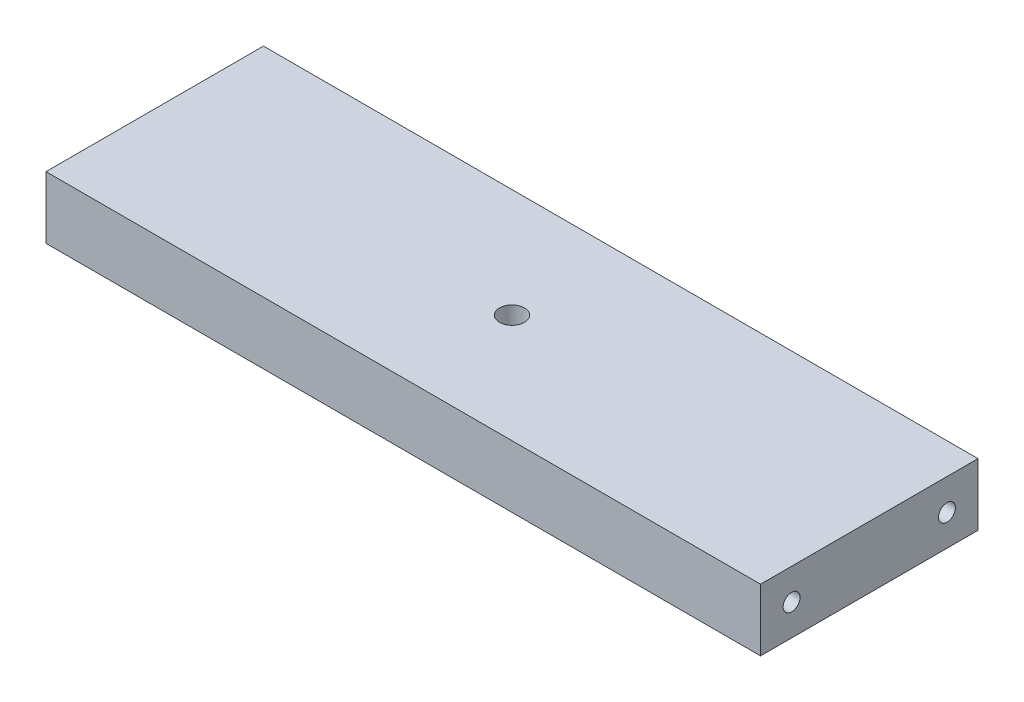
ISO-10303-21;
HEADER;
FILE_DESCRIPTION(('STEP AP214'),'2;1');
FILE_NAME('part.step','',(''),(''),'','','');
FILE_SCHEMA(('AUTOMOTIVE_DESIGN { 1 0 10303 214 1 1 1 1 }'));
ENDSEC;
DATA;
#1=APPLICATION_CONTEXT('core data for automotive mechanical design processes');
#2=APPLICATION_PROTOCOL_DEFINITION('international standard','automotive_design',2000,#1);
#3=PRODUCT_CONTEXT('',#1,'mechanical');
#4=PRODUCT('Part','Part','',(#3));
#5=PRODUCT_RELATED_PRODUCT_CATEGORY('part','',(#4));
#6=PRODUCT_DEFINITION_FORMATION('','',#4);
#7=PRODUCT_DEFINITION_CONTEXT('part definition',#1,'design');
#8=PRODUCT_DEFINITION('design','',#6,#7);
#9=PRODUCT_DEFINITION_SHAPE('','',#8);
#10=(LENGTH_UNIT() NAMED_UNIT(*) SI_UNIT(.MILLI.,.METRE.));
#11=(NAMED_UNIT(*) PLANE_ANGLE_UNIT() SI_UNIT($,.RADIAN.));
#12=(NAMED_UNIT(*) SI_UNIT($,.STERADIAN.) SOLID_ANGLE_UNIT());
#13=UNCERTAINTY_MEASURE_WITH_UNIT(LENGTH_MEASURE(1.E-05),#10,'distance_accuracy_value','');
#14=(GEOMETRIC_REPRESENTATION_CONTEXT(3) GLOBAL_UNCERTAINTY_ASSIGNED_CONTEXT((#13)) GLOBAL_UNIT_ASSIGNED_CONTEXT((#10,
#11,#12)) REPRESENTATION_CONTEXT('',''));
#15=CARTESIAN_POINT('',(0.,0.,0.));
#16=DIRECTION('',(0.,0.,1.));
#17=DIRECTION('',(1.,0.,0.));
#18=AXIS2_PLACEMENT_3D('',#15,#16,#17);
#19=CARTESIAN_POINT('',(73.025,12.7,22.225));
#20=DIRECTION('',(-1.,0.,0.));
#21=DIRECTION('',(0.,0.,1.));
#22=AXIS2_PLACEMENT_3D('',#19,#20,#21);
#23=PLANE('',#22);
#24=CARTESIAN_POINT('',(73.025,6.35,-15.875));
#25=DIRECTION('',(1.,0.,0.));
#26=DIRECTION('',(0.,0.,-1.));
#27=AXIS2_PLACEMENT_3D('',#24,#25,#26);
#28=CIRCLE('',#27,1.72719999999999);
#29=CARTESIAN_POINT('',(73.025,6.35,-17.6022));
#30=VERTEX_POINT('',#29);
#31=EDGE_CURVE('E114',#30,#30,#28,.T.);
#32=ORIENTED_EDGE('',*,*,#31,.F.);
#33=EDGE_LOOP('',(#32));
#34=FACE_BOUND('',#33,.T.);
#35=CARTESIAN_POINT('',(73.025,6.35,15.875));
#36=DIRECTION('',(1.,0.,0.));
#37=DIRECTION('',(0.,0.,-1.));
#38=AXIS2_PLACEMENT_3D('',#35,#36,#37);
#39=CIRCLE('',#38,1.72719999999999);
#40=CARTESIAN_POINT('',(73.025,6.35,14.1478));
#41=VERTEX_POINT('',#40);
#42=EDGE_CURVE('E113',#41,#41,#39,.T.);
#43=ORIENTED_EDGE('',*,*,#42,.F.);
#44=EDGE_LOOP('',(#43));
#45=FACE_BOUND('',#44,.T.);
#46=DIRECTION('',(0.,0.,-1.));
#47=VECTOR('',#46,1.);
#48=CARTESIAN_POINT('',(73.025,0.,22.225));
#49=LINE('',#48,#47);
#50=CARTESIAN_POINT('',(73.025,0.,22.225));
#51=VERTEX_POINT('',#50);
#52=CARTESIAN_POINT('',(73.025,0.,-22.225));
#53=VERTEX_POINT('',#52);
#54=EDGE_CURVE('E151',#51,#53,#49,.T.);
#55=ORIENTED_EDGE('',*,*,#54,.T.);
#56=DIRECTION('',(0.,-1.,0.));
#57=VECTOR('',#56,1.);
#58=CARTESIAN_POINT('',(73.025,12.7,-22.225));
#59=LINE('',#58,#57);
#60=CARTESIAN_POINT('',(73.025,12.7,-22.225));
#61=VERTEX_POINT('',#60);
#62=EDGE_CURVE('E11',#61,#53,#59,.T.);
#63=ORIENTED_EDGE('',*,*,#62,.F.);
#64=DIRECTION('',(0.,0.,-1.));
#65=VECTOR('',#64,1.);
#66=CARTESIAN_POINT('',(73.025,12.7,22.225));
#67=LINE('',#66,#65);
#68=CARTESIAN_POINT('',(73.025,12.7,22.225));
#69=VERTEX_POINT('',#68);
#70=EDGE_CURVE('E152',#69,#61,#67,.T.);
#71=ORIENTED_EDGE('',*,*,#70,.F.);
#72=DIRECTION('',(0.,-1.,0.));
#73=VECTOR('',#72,1.);
#74=CARTESIAN_POINT('',(73.025,12.7,22.225));
#75=LINE('',#74,#73);
#76=EDGE_CURVE('E162',#69,#51,#75,.T.);
#77=ORIENTED_EDGE('',*,*,#76,.T.);
#78=EDGE_LOOP('',(#55,#63,#71,#77));
#79=FACE_BOUND('',#78,.T.);
#80=ADVANCED_FACE('F41',(#34,#45,#79),#23,.F.);
#81=CARTESIAN_POINT('',(-73.025,12.7,-22.225));
#82=DIRECTION('',(0.,0.,1.));
#83=DIRECTION('',(1.,0.,0.));
#84=AXIS2_PLACEMENT_3D('',#81,#82,#83);
#85=PLANE('',#84);
#86=DIRECTION('',(-1.,0.,0.));
#87=VECTOR('',#86,1.);
#88=CARTESIAN_POINT('',(-73.025,0.,-22.225));
#89=LINE('',#88,#87);
#90=CARTESIAN_POINT('',(-73.025,0.,-22.225));
#91=VERTEX_POINT('',#90);
#92=EDGE_CURVE('E166',#53,#91,#89,.T.);
#93=ORIENTED_EDGE('',*,*,#92,.T.);
#94=DIRECTION('',(0.,-1.,0.));
#95=VECTOR('',#94,1.);
#96=CARTESIAN_POINT('',(-73.025,12.7,-22.225));
#97=LINE('',#96,#95);
#98=CARTESIAN_POINT('',(-73.025,12.7,-22.225));
#99=VERTEX_POINT('',#98);
#100=EDGE_CURVE('E50',#99,#91,#97,.T.);
#101=ORIENTED_EDGE('',*,*,#100,.F.);
#102=DIRECTION('',(-1.,0.,0.));
#103=VECTOR('',#102,1.);
#104=CARTESIAN_POINT('',(-73.025,12.7,-22.225));
#105=LINE('',#104,#103);
#106=EDGE_CURVE('E89',#61,#99,#105,.T.);
#107=ORIENTED_EDGE('',*,*,#106,.F.);
#108=ORIENTED_EDGE('',*,*,#62,.T.);
#109=EDGE_LOOP('',(#93,#101,#107,#108));
#110=FACE_BOUND('',#109,.T.);
#111=ADVANCED_FACE('F196',(#110),#85,.F.);
#112=CARTESIAN_POINT('',(-73.025,12.7,22.225));
#113=DIRECTION('',(1.,0.,0.));
#114=DIRECTION('',(0.,0.,-1.));
#115=AXIS2_PLACEMENT_3D('',#112,#113,#114);
#116=PLANE('',#115);
#117=CARTESIAN_POINT('',(-73.025,6.35,-15.875));
#118=DIRECTION('',(-1.,0.,0.));
#119=DIRECTION('',(0.,0.,1.));
#120=AXIS2_PLACEMENT_3D('',#117,#118,#119);
#121=CIRCLE('',#120,1.72719999999999);
#122=CARTESIAN_POINT('',(-73.025,6.35,-14.1478));
#123=VERTEX_POINT('',#122);
#124=EDGE_CURVE('E127',#123,#123,#121,.T.);
#125=ORIENTED_EDGE('',*,*,#124,.F.);
#126=EDGE_LOOP('',(#125));
#127=FACE_BOUND('',#126,.T.);
#128=CARTESIAN_POINT('',(-73.025,6.35,15.875));
#129=DIRECTION('',(-1.,0.,0.));
#130=DIRECTION('',(0.,0.,1.));
#131=AXIS2_PLACEMENT_3D('',#128,#129,#130);
#132=CIRCLE('',#131,1.72719999999999);
#133=CARTESIAN_POINT('',(-73.025,6.35,17.6022));
#134=VERTEX_POINT('',#133);
#135=EDGE_CURVE('E135',#134,#134,#132,.T.);
#136=ORIENTED_EDGE('',*,*,#135,.F.);
#137=EDGE_LOOP('',(#136));
#138=FACE_BOUND('',#137,.T.);
#139=DIRECTION('',(0.,0.,1.));
#140=VECTOR('',#139,1.);
#141=CARTESIAN_POINT('',(-73.025,0.,22.225));
#142=LINE('',#141,#140);
#143=CARTESIAN_POINT('',(-73.025,0.,22.225));
#144=VERTEX_POINT('',#143);
#145=EDGE_CURVE('E76',#91,#144,#142,.T.);
#146=ORIENTED_EDGE('',*,*,#145,.T.);
#147=DIRECTION('',(0.,-1.,0.));
#148=VECTOR('',#147,1.);
#149=CARTESIAN_POINT('',(-73.025,12.7,22.225));
#150=LINE('',#149,#148);
#151=CARTESIAN_POINT('',(-73.025,12.7,22.225));
#152=VERTEX_POINT('',#151);
#153=EDGE_CURVE('E175',#152,#144,#150,.T.);
#154=ORIENTED_EDGE('',*,*,#153,.F.);
#155=DIRECTION('',(0.,0.,1.));
#156=VECTOR('',#155,1.);
#157=CARTESIAN_POINT('',(-73.025,12.7,22.225));
#158=LINE('',#157,#156);
#159=EDGE_CURVE('E157',#99,#152,#158,.T.);
#160=ORIENTED_EDGE('',*,*,#159,.F.);
#161=ORIENTED_EDGE('',*,*,#100,.T.);
#162=EDGE_LOOP('',(#146,#154,#160,#161));
#163=FACE_BOUND('',#162,.T.);
#164=ADVANCED_FACE('F179',(#127,#138,#163),#116,.F.);
#165=CARTESIAN_POINT('',(-73.025,12.7,22.225));
#166=DIRECTION('',(0.,0.,-1.));
#167=DIRECTION('',(-1.,0.,0.));
#168=AXIS2_PLACEMENT_3D('',#165,#166,#167);
#169=PLANE('',#168);
#170=DIRECTION('',(1.,0.,0.));
#171=VECTOR('',#170,1.);
#172=CARTESIAN_POINT('',(-73.025,0.,22.225));
#173=LINE('',#172,#171);
#174=EDGE_CURVE('E82',#144,#51,#173,.T.);
#175=ORIENTED_EDGE('',*,*,#174,.T.);
#176=ORIENTED_EDGE('',*,*,#76,.F.);
#177=DIRECTION('',(1.,0.,0.));
#178=VECTOR('',#177,1.);
#179=CARTESIAN_POINT('',(-73.025,12.7,22.225));
#180=LINE('',#179,#178);
#181=EDGE_CURVE('E58',#152,#69,#180,.T.);
#182=ORIENTED_EDGE('',*,*,#181,.F.);
#183=ORIENTED_EDGE('',*,*,#153,.T.);
#184=EDGE_LOOP('',(#175,#176,#182,#183));
#185=FACE_BOUND('',#184,.T.);
#186=ADVANCED_FACE('F186',(#185),#169,.F.);
#187=CARTESIAN_POINT('',(0.,12.7,0.));
#188=DIRECTION('',(0.,-1.,0.));
#189=DIRECTION('',(0.,0.,-1.));
#190=AXIS2_PLACEMENT_3D('',#187,#188,#189);
#191=PLANE('',#190);
#192=CARTESIAN_POINT('',(0.,12.7,0.));
#193=DIRECTION('',(0.,-1.,0.));
#194=DIRECTION('',(0.,0.,-1.));
#195=AXIS2_PLACEMENT_3D('',#192,#193,#194);
#196=CIRCLE('',#195,2.5527);
#197=CARTESIAN_POINT('',(0.,12.7,-2.5527));
#198=VERTEX_POINT('',#197);
#199=EDGE_CURVE('E147',#198,#198,#196,.T.);
#200=ORIENTED_EDGE('',*,*,#199,.T.);
#201=EDGE_LOOP('',(#200));
#202=FACE_BOUND('',#201,.T.);
#203=ORIENTED_EDGE('',*,*,#70,.T.);
#204=ORIENTED_EDGE('',*,*,#106,.T.);
#205=ORIENTED_EDGE('',*,*,#159,.T.);
#206=ORIENTED_EDGE('',*,*,#181,.T.);
#207=EDGE_LOOP('',(#203,#204,#205,#206));
#208=FACE_BOUND('',#207,.T.);
#209=ADVANCED_FACE('F188',(#202,#208),#191,.F.);
#210=CARTESIAN_POINT('',(0.,0.,0.));
#211=DIRECTION('',(0.,-1.,0.));
#212=DIRECTION('',(0.,0.,-1.));
#213=AXIS2_PLACEMENT_3D('',#210,#211,#212);
#214=PLANE('',#213);
#215=CARTESIAN_POINT('',(0.,0.,0.));
#216=DIRECTION('',(0.,-1.,0.));
#217=DIRECTION('',(0.,0.,-1.));
#218=AXIS2_PLACEMENT_3D('',#215,#216,#217);
#219=CIRCLE('',#218,2.5527);
#220=CARTESIAN_POINT('',(0.,0.,-2.5527));
#221=VERTEX_POINT('',#220);
#222=EDGE_CURVE('E143',#221,#221,#219,.T.);
#223=ORIENTED_EDGE('',*,*,#222,.F.);
#224=EDGE_LOOP('',(#223));
#225=FACE_BOUND('',#224,.T.);
#226=ORIENTED_EDGE('',*,*,#54,.F.);
#227=ORIENTED_EDGE('',*,*,#174,.F.);
#228=ORIENTED_EDGE('',*,*,#145,.F.);
#229=ORIENTED_EDGE('',*,*,#92,.F.);
#230=EDGE_LOOP('',(#226,#227,#228,#229));
#231=FACE_BOUND('',#230,.T.);
#232=ADVANCED_FACE('F182',(#225,#231),#214,.T.);
#233=CARTESIAN_POINT('',(0.,0.,0.));
#234=DIRECTION('',(0.,-1.,0.));
#235=DIRECTION('',(0.,0.,-1.));
#236=AXIS2_PLACEMENT_3D('',#233,#234,#235);
#237=CYLINDRICAL_SURFACE('',#236,2.5527);
#238=ORIENTED_EDGE('',*,*,#199,.F.);
#239=EDGE_LOOP('',(#238));
#240=FACE_BOUND('',#239,.T.);
#241=ORIENTED_EDGE('',*,*,#222,.T.);
#242=EDGE_LOOP('',(#241));
#243=FACE_BOUND('',#242,.T.);
#244=ADVANCED_FACE('F236',(#240,#243),#237,.F.);
#245=CARTESIAN_POINT('',(-66.675,6.35,15.875));
#246=DIRECTION('',(-1.,0.,0.));
#247=DIRECTION('',(0.,0.,1.));
#248=AXIS2_PLACEMENT_3D('',#245,#246,#247);
#249=CONICAL_SURFACE('',#248,1.7272,1.02974425867665);
#250=CARTESIAN_POINT('',(-65.6371935388156,6.35,15.875));
#251=VERTEX_POINT('',#250);
#252=VERTEX_LOOP('',#251);
#253=FACE_BOUND('',#252,.T.);
#254=CARTESIAN_POINT('',(-66.675,6.35,15.875));
#255=DIRECTION('',(-1.,0.,0.));
#256=DIRECTION('',(0.,0.,1.));
#257=AXIS2_PLACEMENT_3D('',#254,#255,#256);
#258=CIRCLE('',#257,1.7272);
#259=CARTESIAN_POINT('',(-66.675,6.35,17.6022));
#260=VERTEX_POINT('',#259);
#261=EDGE_CURVE('E139',#260,#260,#258,.T.);
#262=ORIENTED_EDGE('',*,*,#261,.T.);
#263=EDGE_LOOP('',(#262));
#264=FACE_BOUND('',#263,.T.);
#265=ADVANCED_FACE('F232',(#253,#264),#249,.F.);
#266=CARTESIAN_POINT('',(-73.025,6.35,15.875));
#267=DIRECTION('',(-1.,0.,0.));
#268=DIRECTION('',(0.,0.,1.));
#269=AXIS2_PLACEMENT_3D('',#266,#267,#268);
#270=CYLINDRICAL_SURFACE('',#269,1.72719999999999);
#271=ORIENTED_EDGE('',*,*,#261,.F.);
#272=EDGE_LOOP('',(#271));
#273=FACE_BOUND('',#272,.T.);
#274=ORIENTED_EDGE('',*,*,#135,.T.);
#275=EDGE_LOOP('',(#274));
#276=FACE_BOUND('',#275,.T.);
#277=ADVANCED_FACE('F228',(#273,#276),#270,.F.);
#278=CARTESIAN_POINT('',(-66.675,6.35,-15.875));
#279=DIRECTION('',(-1.,0.,0.));
#280=DIRECTION('',(0.,0.,1.));
#281=AXIS2_PLACEMENT_3D('',#278,#279,#280);
#282=CONICAL_SURFACE('',#281,1.7272,1.02974425867665);
#283=CARTESIAN_POINT('',(-65.6371935388156,6.35,-15.875));
#284=VERTEX_POINT('',#283);
#285=VERTEX_LOOP('',#284);
#286=FACE_BOUND('',#285,.T.);
#287=CARTESIAN_POINT('',(-66.675,6.35,-15.875));
#288=DIRECTION('',(-1.,0.,0.));
#289=DIRECTION('',(0.,0.,1.));
#290=AXIS2_PLACEMENT_3D('',#287,#288,#289);
#291=CIRCLE('',#290,1.7272);
#292=CARTESIAN_POINT('',(-66.675,6.35,-14.1478));
#293=VERTEX_POINT('',#292);
#294=EDGE_CURVE('E131',#293,#293,#291,.T.);
#295=ORIENTED_EDGE('',*,*,#294,.T.);
#296=EDGE_LOOP('',(#295));
#297=FACE_BOUND('',#296,.T.);
#298=ADVANCED_FACE('F224',(#286,#297),#282,.F.);
#299=CARTESIAN_POINT('',(-73.025,6.35,-15.875));
#300=DIRECTION('',(-1.,0.,0.));
#301=DIRECTION('',(0.,0.,1.));
#302=AXIS2_PLACEMENT_3D('',#299,#300,#301);
#303=CYLINDRICAL_SURFACE('',#302,1.72719999999999);
#304=ORIENTED_EDGE('',*,*,#294,.F.);
#305=EDGE_LOOP('',(#304));
#306=FACE_BOUND('',#305,.T.);
#307=ORIENTED_EDGE('',*,*,#124,.T.);
#308=EDGE_LOOP('',(#307));
#309=FACE_BOUND('',#308,.T.);
#310=ADVANCED_FACE('F216',(#306,#309),#303,.F.);
#311=CARTESIAN_POINT('',(66.675,6.35,15.875));
#312=DIRECTION('',(1.,0.,0.));
#313=DIRECTION('',(0.,0.,-1.));
#314=AXIS2_PLACEMENT_3D('',#311,#312,#313);
#315=CONICAL_SURFACE('',#314,1.7272,1.02974425867665);
#316=CARTESIAN_POINT('',(65.6371935388156,6.35,15.875));
#317=VERTEX_POINT('',#316);
#318=VERTEX_LOOP('',#317);
#319=FACE_BOUND('',#318,.T.);
#320=CARTESIAN_POINT('',(66.675,6.35,15.875));
#321=DIRECTION('',(1.,0.,0.));
#322=DIRECTION('',(0.,0.,-1.));
#323=AXIS2_PLACEMENT_3D('',#320,#321,#322);
#324=CIRCLE('',#323,1.7272);
#325=CARTESIAN_POINT('',(66.675,6.35,14.1478));
#326=VERTEX_POINT('',#325);
#327=EDGE_CURVE('E119',#326,#326,#324,.T.);
#328=ORIENTED_EDGE('',*,*,#327,.T.);
#329=EDGE_LOOP('',(#328));
#330=FACE_BOUND('',#329,.T.);
#331=ADVANCED_FACE('F210',(#319,#330),#315,.F.);
#332=CARTESIAN_POINT('',(73.025,6.35,15.875));
#333=DIRECTION('',(1.,0.,0.));
#334=DIRECTION('',(0.,0.,-1.));
#335=AXIS2_PLACEMENT_3D('',#332,#333,#334);
#336=CYLINDRICAL_SURFACE('',#335,1.72719999999999);
#337=ORIENTED_EDGE('',*,*,#327,.F.);
#338=EDGE_LOOP('',(#337));
#339=FACE_BOUND('',#338,.T.);
#340=ORIENTED_EDGE('',*,*,#42,.T.);
#341=EDGE_LOOP('',(#340));
#342=FACE_BOUND('',#341,.T.);
#343=ADVANCED_FACE('F106',(#339,#342),#336,.F.);
#344=CARTESIAN_POINT('',(66.675,6.35,-15.875));
#345=DIRECTION('',(1.,0.,0.));
#346=DIRECTION('',(0.,0.,-1.));
#347=AXIS2_PLACEMENT_3D('',#344,#345,#346);
#348=CONICAL_SURFACE('',#347,1.7272,1.02974425867665);
#349=CARTESIAN_POINT('',(65.6371935388156,6.35,-15.875));
#350=VERTEX_POINT('',#349);
#351=VERTEX_LOOP('',#350);
#352=FACE_BOUND('',#351,.T.);
#353=CARTESIAN_POINT('',(66.675,6.35,-15.875));
#354=DIRECTION('',(1.,0.,0.));
#355=DIRECTION('',(0.,0.,-1.));
#356=AXIS2_PLACEMENT_3D('',#353,#354,#355);
#357=CIRCLE('',#356,1.7272);
#358=CARTESIAN_POINT('',(66.675,6.35,-17.6022));
#359=VERTEX_POINT('',#358);
#360=EDGE_CURVE('E110',#359,#359,#357,.T.);
#361=ORIENTED_EDGE('',*,*,#360,.T.);
#362=EDGE_LOOP('',(#361));
#363=FACE_BOUND('',#362,.T.);
#364=ADVANCED_FACE('F102',(#352,#363),#348,.F.);
#365=CARTESIAN_POINT('',(73.025,6.35,-15.875));
#366=DIRECTION('',(1.,0.,0.));
#367=DIRECTION('',(0.,0.,-1.));
#368=AXIS2_PLACEMENT_3D('',#365,#366,#367);
#369=CYLINDRICAL_SURFACE('',#368,1.72719999999999);
#370=ORIENTED_EDGE('',*,*,#360,.F.);
#371=EDGE_LOOP('',(#370));
#372=FACE_BOUND('',#371,.T.);
#373=ORIENTED_EDGE('',*,*,#31,.T.);
#374=EDGE_LOOP('',(#373));
#375=FACE_BOUND('',#374,.T.);
#376=ADVANCED_FACE('F105',(#372,#375),#369,.F.);
#377=CLOSED_SHELL('',(#80,#111,#164,#186,#209,#232,#244,#265,#277,#298,#310,#331,#343,#364,#376));
#378=MANIFOLD_SOLID_BREP('B2',#377);
#379=ADVANCED_BREP_SHAPE_REPRESENTATION('',(#18,#378),#14);
#380=SHAPE_DEFINITION_REPRESENTATION(#9,#379);
ENDSEC;
END-ISO-10303-21;
